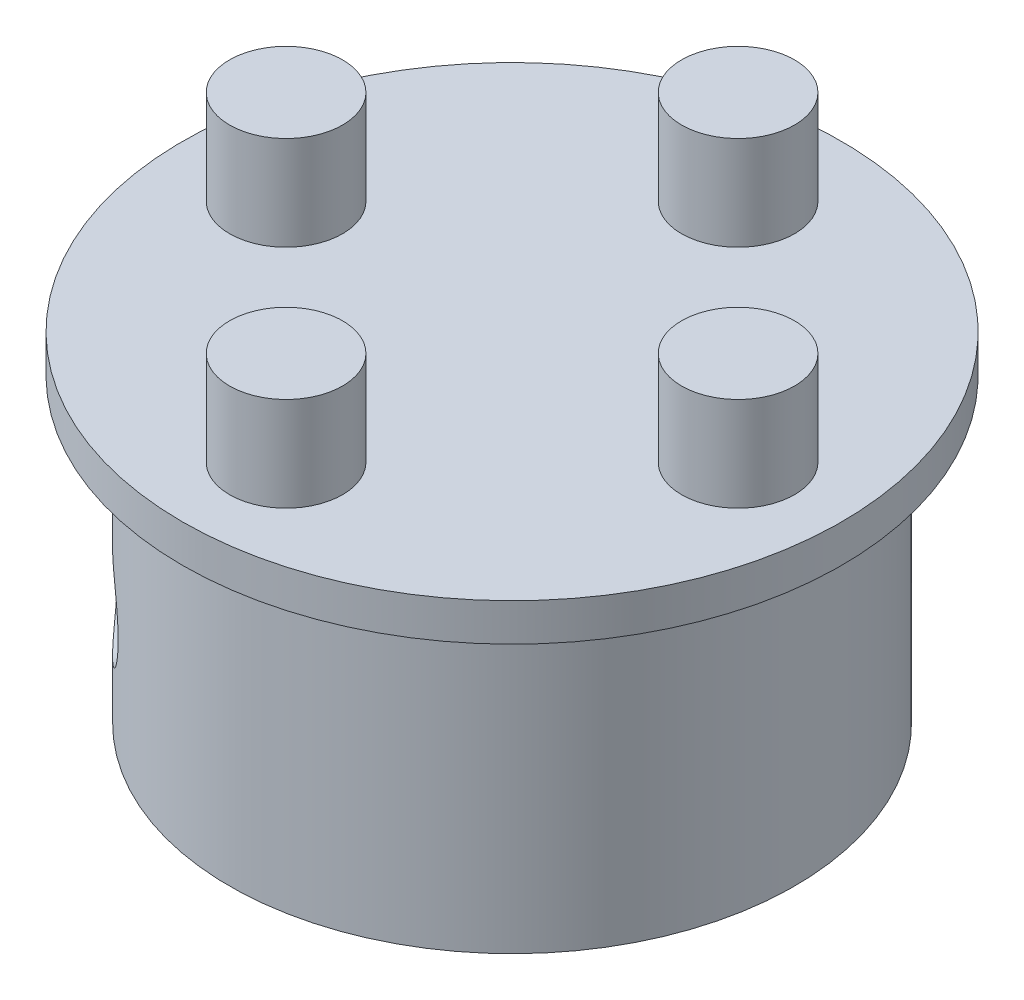
ISO-10303-21;
HEADER;
FILE_DESCRIPTION(('STEP AP214'),'2;1');
FILE_NAME('part.step','',(''),(''),'','','');
FILE_SCHEMA(('AUTOMOTIVE_DESIGN { 1 0 10303 214 1 1 1 1 }'));
ENDSEC;
DATA;
#1=APPLICATION_CONTEXT('core data for automotive mechanical design processes');
#2=APPLICATION_PROTOCOL_DEFINITION('international standard','automotive_design',2000,#1);
#3=PRODUCT_CONTEXT('',#1,'mechanical');
#4=PRODUCT('Part','Part','',(#3));
#5=PRODUCT_RELATED_PRODUCT_CATEGORY('part','',(#4));
#6=PRODUCT_DEFINITION_FORMATION('','',#4);
#7=PRODUCT_DEFINITION_CONTEXT('part definition',#1,'design');
#8=PRODUCT_DEFINITION('design','',#6,#7);
#9=PRODUCT_DEFINITION_SHAPE('','',#8);
#10=(LENGTH_UNIT() NAMED_UNIT(*) SI_UNIT(.MILLI.,.METRE.));
#11=(NAMED_UNIT(*) PLANE_ANGLE_UNIT() SI_UNIT($,.RADIAN.));
#12=(NAMED_UNIT(*) SI_UNIT($,.STERADIAN.) SOLID_ANGLE_UNIT());
#13=UNCERTAINTY_MEASURE_WITH_UNIT(LENGTH_MEASURE(1.E-05),#10,'distance_accuracy_value','');
#14=(GEOMETRIC_REPRESENTATION_CONTEXT(3) GLOBAL_UNCERTAINTY_ASSIGNED_CONTEXT((#13)) GLOBAL_UNIT_ASSIGNED_CONTEXT((#10,
#11,#12)) REPRESENTATION_CONTEXT('',''));
#15=CARTESIAN_POINT('',(0.,0.,0.));
#16=DIRECTION('',(0.,0.,1.));
#17=DIRECTION('',(1.,0.,0.));
#18=AXIS2_PLACEMENT_3D('',#15,#16,#17);
#19=CARTESIAN_POINT('',(0.,-16.,0.));
#20=DIRECTION('',(0.,1.,0.));
#21=DIRECTION('',(0.,0.,1.));
#22=AXIS2_PLACEMENT_3D('',#19,#20,#21);
#23=CYLINDRICAL_SURFACE('',#22,15.);
#24=CARTESIAN_POINT('',(0.,-16.,0.));
#25=DIRECTION('',(0.,-1.,0.));
#26=DIRECTION('',(0.,0.,-1.));
#27=AXIS2_PLACEMENT_3D('',#24,#25,#26);
#28=CIRCLE('',#27,15.);
#29=CARTESIAN_POINT('',(0.,-16.,-15.));
#30=VERTEX_POINT('',#29);
#31=EDGE_CURVE('E57',#30,#30,#28,.T.);
#32=ORIENTED_EDGE('',*,*,#31,.F.);
#33=EDGE_LOOP('',(#32));
#34=FACE_BOUND('',#33,.T.);
#35=CARTESIAN_POINT('',(0.,0.,0.));
#36=DIRECTION('',(0.,-1.,0.));
#37=DIRECTION('',(0.,0.,-1.));
#38=AXIS2_PLACEMENT_3D('',#35,#36,#37);
#39=CIRCLE('',#38,15.);
#40=CARTESIAN_POINT('',(0.,0.,-15.));
#41=VERTEX_POINT('',#40);
#42=EDGE_CURVE('E10',#41,#41,#39,.T.);
#43=ORIENTED_EDGE('',*,*,#42,.T.);
#44=EDGE_LOOP('',(#43));
#45=FACE_BOUND('',#44,.T.);
#46=CARTESIAN_POINT('',(-12.2260172846424,-10.4229808599025,8.69048337870951));
#47=CARTESIAN_POINT('',(-12.226015102749,-10.5623566080644,8.69048911864681));
#48=CARTESIAN_POINT('',(-12.2191559695436,-10.701808465974,8.7001610521806));
#49=CARTESIAN_POINT('',(-12.191795114123,-10.9767994031657,8.73845893769872));
#50=CARTESIAN_POINT('',(-12.1712808105791,-11.1123347536606,8.76710236914278));
#51=CARTESIAN_POINT('',(-12.1169009358028,-11.3754731432442,8.8421062297121));
#52=CARTESIAN_POINT('',(-12.0830465224063,-11.5030827085648,8.88845185151163));
#53=CARTESIAN_POINT('',(-12.0024511640444,-11.7469618146203,8.99698359757107));
#54=CARTESIAN_POINT('',(-11.9557116692274,-11.8632326294799,9.05916793920617));
#55=CARTESIAN_POINT('',(-11.849534387441,-12.0822937096471,9.19761875481193));
#56=CARTESIAN_POINT('',(-11.7899882067551,-12.1849559912888,9.27400462935664));
#57=CARTESIAN_POINT('',(-11.6593753942738,-12.3727741667644,9.43768547912518));
#58=CARTESIAN_POINT('',(-11.5883080801228,-12.457929023018,9.52498110042419));
#59=CARTESIAN_POINT('',(-11.4354583141163,-12.6087954271218,9.70796410468636));
#60=CARTESIAN_POINT('',(-11.3536144278216,-12.6743878676343,9.80369847366016));
#61=CARTESIAN_POINT('',(-11.1812553718978,-12.7835019304331,9.99982755370866));
#62=CARTESIAN_POINT('',(-11.0907407665399,-12.8270249877874,10.1002219612995));
#63=CARTESIAN_POINT('',(-10.9040893708528,-12.8903733948864,10.3014311335364));
#64=CARTESIAN_POINT('',(-10.8080121874521,-12.9104137759072,10.4022334644735));
#65=CARTESIAN_POINT('',(-10.6120648806183,-12.9268966140551,10.60205891587));
#66=CARTESIAN_POINT('',(-10.5121950154528,-12.9233406751498,10.7010821568047));
#67=CARTESIAN_POINT('',(-10.3125912431234,-12.8928995083743,10.8935532647143));
#68=CARTESIAN_POINT('',(-10.2128657866835,-12.8662456964934,10.9870466392295));
#69=CARTESIAN_POINT('',(-10.0156286044497,-12.7907297856561,11.1671406550701));
#70=CARTESIAN_POINT('',(-9.91811694617329,-12.741867010313,11.2537410863727));
#71=CARTESIAN_POINT('',(-9.72800092105717,-12.6230902195872,11.4184897971173));
#72=CARTESIAN_POINT('',(-9.63542106567276,-12.5530808478201,11.4965975640944));
#73=CARTESIAN_POINT('',(-9.45874951759188,-12.3940680372675,11.6423879310937));
#74=CARTESIAN_POINT('',(-9.37465851269917,-12.3050630611917,11.7100696865882));
#75=CARTESIAN_POINT('',(-9.21694697016389,-12.1093020532832,11.8346156486351));
#76=CARTESIAN_POINT('',(-9.14346583790286,-12.0023437650016,11.8913386542159));
#77=CARTESIAN_POINT('',(-9.01096223968904,-11.7743937696867,11.9920602075388));
#78=CARTESIAN_POINT('',(-8.95193990710789,-11.6534019332197,12.0360586379068));
#79=CARTESIAN_POINT('',(-8.85063857691095,-11.4005892180251,12.1107465207493));
#80=CARTESIAN_POINT('',(-8.80837840703758,-11.2687563618105,12.1414210110476));
#81=CARTESIAN_POINT('',(-8.7424787493457,-10.998131787595,12.1889594445614));
#82=CARTESIAN_POINT('',(-8.71883762196759,-10.8593406834701,12.205824603807));
#83=CARTESIAN_POINT('',(-8.69137309694338,-10.5805147037404,12.2253964599861));
#84=CARTESIAN_POINT('',(-8.68731638314832,-10.4405144802004,12.2282698494846));
#85=CARTESIAN_POINT('',(-8.69856432751127,-10.1616941882117,12.2202710469741));
#86=CARTESIAN_POINT('',(-8.713868237846,-10.0228740743886,12.2093993858813));
#87=CARTESIAN_POINT('',(-8.76301491468283,-9.75125310071168,12.1741720398917));
#88=CARTESIAN_POINT('',(-8.79673979908783,-9.61841972002453,12.1499020848004));
#89=CARTESIAN_POINT('',(-8.88125236105555,-9.36151069362306,12.0882618969943));
#90=CARTESIAN_POINT('',(-8.93204105934917,-9.23743557235164,12.0508908805886));
#91=CARTESIAN_POINT('',(-9.04922350572719,-9.00030626549644,11.96314927769));
#92=CARTESIAN_POINT('',(-9.11575686646056,-8.88736428714649,11.9126619687432));
#93=CARTESIAN_POINT('',(-9.26165435658245,-8.67686732720754,11.7995871178785));
#94=CARTESIAN_POINT('',(-9.34101938840285,-8.5793134287928,11.7369987248491));
#95=CARTESIAN_POINT('',(-9.51061176947301,-8.40132896717384,11.6000105839626));
#96=CARTESIAN_POINT('',(-9.60094350055352,-8.321087033618,11.5254947700273));
#97=CARTESIAN_POINT('',(-9.7886260213421,-8.18132553289766,11.3665255375608));
#98=CARTESIAN_POINT('',(-9.88597658388232,-8.12180529542869,11.2820724405986));
#99=CARTESIAN_POINT('',(-10.0839681570189,-8.02547027594768,11.1054532717412));
#100=CARTESIAN_POINT('',(-10.1845928127748,-7.98855678416762,11.0133227559656));
#101=CARTESIAN_POINT('',(-10.3862849909112,-7.93816526093871,10.8233204473603));
#102=CARTESIAN_POINT('',(-10.4873524761655,-7.92468530117019,10.7254491276204));
#103=CARTESIAN_POINT('',(-10.685636212747,-7.92159897759035,10.5278930277834));
#104=CARTESIAN_POINT('',(-10.7828842733313,-7.93170560596146,10.4282445395955));
#105=CARTESIAN_POINT('',(-10.9721290836373,-7.97488478217197,10.2289429223718));
#106=CARTESIAN_POINT('',(-11.0641258627609,-8.00795720141221,10.1292897933651));
#107=CARTESIAN_POINT('',(-11.2404991418113,-8.09601902544619,9.93320515098368));
#108=CARTESIAN_POINT('',(-11.3248839982044,-8.15098402811259,9.83677017982437));
#109=CARTESIAN_POINT('',(-11.4843390375278,-8.28123879613312,9.65013169078747));
#110=CARTESIAN_POINT('',(-11.5594087786578,-8.35652952496499,9.55992846856116));
#111=CARTESIAN_POINT('',(-11.6996397728828,-8.52631595236305,9.38780655473241));
#112=CARTESIAN_POINT('',(-11.7646776404091,-8.6210218146538,9.30599462836741));
#113=CARTESIAN_POINT('',(-11.8827363534089,-8.82650916780636,9.15476947871123));
#114=CARTESIAN_POINT('',(-11.935754380606,-8.93729441881508,9.0853591640167));
#115=CARTESIAN_POINT('',(-12.0292989396194,-9.17272618239216,8.96114243393515));
#116=CARTESIAN_POINT('',(-12.0697344599588,-9.29746519966803,8.9064427923207));
#117=CARTESIAN_POINT('',(-12.1369976176125,-9.55659009574069,8.81456513794917));
#118=CARTESIAN_POINT('',(-12.1638388501988,-9.69096618257991,8.77736962244662));
#119=CARTESIAN_POINT('',(-12.1977853703693,-9.92538462938993,8.73009687074421));
#120=CARTESIAN_POINT('',(-12.2083637940047,-10.0240076678652,8.71527408904282));
#121=CARTESIAN_POINT('',(-12.2224804710945,-10.2227343447395,8.69546537021194));
#122=CARTESIAN_POINT('',(-12.2260188523551,-10.3228379562267,8.69047925450573));
#123=CARTESIAN_POINT('',(-12.2260172846424,-10.4229808599025,8.69048337870951));
#124=B_SPLINE_CURVE_WITH_KNOTS('',3,(#46,#47,#48,#49,#50,#51,#52,#53,#54,#55,#56,#57,#58,#59,
#60,#61,#62,#63,#64,#65,#66,#67,#68,#69,#70,#71,#72,#73,#74,#75,#76,#77,#78,#79,#80,#81,#82,#83,
#84,#85,#86,#87,#88,#89,#90,#91,#92,#93,#94,#95,#96,#97,#98,#99,#100,#101,#102,#103,#104,#105,
#106,#107,#108,#109,#110,#111,#112,#113,#114,#115,#116,#117,#118,#119,#120,#121,#122,#123),
.UNSPECIFIED.,.T.,.F.,(4,2,2,2,2,2,2,2,2,2,2,2,2,2,2,2,2,2,2,2,2,2,2,2,2,2,2,2,2,2,2,2,2,2,2,2,
2,2,4),(0.,0.41776103892774,0.835907519962969,1.25370499787519,1.67145547405274,
2.09289159155714,2.51435267834447,2.93832980111435,3.36227935111113,3.78231567472565,
4.20232344652692,4.61817121164668,5.03403164249533,5.45179604139425,5.86959426226764,
6.29246123462124,6.71533210746019,7.13867662498604,7.56198385938077,7.98023542420411,
8.39847083413976,8.81406064635492,9.22967532293574,9.64912342762702,10.0686010443069,
10.4924411303538,10.916267504767,11.3382298441765,11.7601574591235,12.1769777626592,
12.5937957321882,13.0101503983246,13.4265248039234,13.8476699746325,14.2689137888181,
14.6931372761832,15.1169356674445,15.4171067054376,15.7172722940182),.UNSPECIFIED.);
#125=CARTESIAN_POINT('',(-12.2260172846424,-10.4229808599025,8.69048337870951));
#126=VERTEX_POINT('',#125);
#127=EDGE_CURVE('E39',#126,#126,#124,.T.);
#128=ORIENTED_EDGE('',*,*,#127,.F.);
#129=EDGE_LOOP('',(#128));
#130=FACE_BOUND('',#129,.T.);
#131=ADVANCED_FACE('F35',(#34,#45,#130),#23,.T.);
#132=CARTESIAN_POINT('',(0.,2.,0.));
#133=DIRECTION('',(0.,-1.,0.));
#134=DIRECTION('',(0.,0.,-1.));
#135=AXIS2_PLACEMENT_3D('',#132,#133,#134);
#136=CYLINDRICAL_SURFACE('',#135,17.5);
#137=CARTESIAN_POINT('',(0.,2.,0.));
#138=DIRECTION('',(0.,1.,0.));
#139=DIRECTION('',(0.,0.,1.));
#140=AXIS2_PLACEMENT_3D('',#137,#138,#139);
#141=CIRCLE('',#140,17.5);
#142=CARTESIAN_POINT('',(0.,2.,17.5));
#143=VERTEX_POINT('',#142);
#144=EDGE_CURVE('E48',#143,#143,#141,.T.);
#145=ORIENTED_EDGE('',*,*,#144,.F.);
#146=EDGE_LOOP('',(#145));
#147=FACE_BOUND('',#146,.T.);
#148=CARTESIAN_POINT('',(0.,0.,0.));
#149=DIRECTION('',(0.,1.,0.));
#150=DIRECTION('',(0.,0.,1.));
#151=AXIS2_PLACEMENT_3D('',#148,#149,#150);
#152=CIRCLE('',#151,17.5);
#153=CARTESIAN_POINT('',(0.,0.,17.5));
#154=VERTEX_POINT('',#153);
#155=EDGE_CURVE('E53',#154,#154,#152,.T.);
#156=ORIENTED_EDGE('',*,*,#155,.T.);
#157=EDGE_LOOP('',(#156));
#158=FACE_BOUND('',#157,.T.);
#159=ADVANCED_FACE('F37',(#147,#158),#136,.T.);
#160=CARTESIAN_POINT('',(0.,2.,0.));
#161=DIRECTION('',(0.,1.,0.));
#162=DIRECTION('',(0.,0.,1.));
#163=AXIS2_PLACEMENT_3D('',#160,#161,#162);
#164=PLANE('',#163);
#165=CARTESIAN_POINT('',(1.25693328198353E-13,2.,-12.));
#166=DIRECTION('',(0.,1.,0.));
#167=DIRECTION('',(0.,0.,1.));
#168=AXIS2_PLACEMENT_3D('',#165,#166,#167);
#169=CIRCLE('',#168,3.);
#170=CARTESIAN_POINT('',(1.25693328198353E-13,2.,-9.));
#171=VERTEX_POINT('',#170);
#172=EDGE_CURVE('E59',#171,#171,#169,.T.);
#173=ORIENTED_EDGE('',*,*,#172,.F.);
#174=EDGE_LOOP('',(#173));
#175=FACE_BOUND('',#174,.T.);
#176=CARTESIAN_POINT('',(-12.,2.,0.));
#177=DIRECTION('',(0.,1.,0.));
#178=DIRECTION('',(0.,0.,1.));
#179=AXIS2_PLACEMENT_3D('',#176,#177,#178);
#180=CIRCLE('',#179,3.);
#181=CARTESIAN_POINT('',(-12.,2.,2.99999999999992));
#182=VERTEX_POINT('',#181);
#183=EDGE_CURVE('E66',#182,#182,#180,.T.);
#184=ORIENTED_EDGE('',*,*,#183,.F.);
#185=EDGE_LOOP('',(#184));
#186=FACE_BOUND('',#185,.T.);
#187=CARTESIAN_POINT('',(0.,2.,12.));
#188=DIRECTION('',(0.,1.,0.));
#189=DIRECTION('',(0.,0.,1.));
#190=AXIS2_PLACEMENT_3D('',#187,#188,#189);
#191=CIRCLE('',#190,3.);
#192=CARTESIAN_POINT('',(0.,2.,15.));
#193=VERTEX_POINT('',#192);
#194=EDGE_CURVE('E72',#193,#193,#191,.T.);
#195=ORIENTED_EDGE('',*,*,#194,.F.);
#196=EDGE_LOOP('',(#195));
#197=FACE_BOUND('',#196,.T.);
#198=CARTESIAN_POINT('',(12.,2.,0.));
#199=DIRECTION('',(0.,1.,0.));
#200=DIRECTION('',(0.,0.,1.));
#201=AXIS2_PLACEMENT_3D('',#198,#199,#200);
#202=CIRCLE('',#201,3.);
#203=CARTESIAN_POINT('',(12.,2.,3.));
#204=VERTEX_POINT('',#203);
#205=EDGE_CURVE('E75',#204,#204,#202,.T.);
#206=ORIENTED_EDGE('',*,*,#205,.F.);
#207=EDGE_LOOP('',(#206));
#208=FACE_BOUND('',#207,.T.);
#209=ORIENTED_EDGE('',*,*,#144,.T.);
#210=EDGE_LOOP('',(#209));
#211=FACE_BOUND('',#210,.T.);
#212=ADVANCED_FACE('F89',(#175,#186,#197,#208,#211),#164,.T.);
#213=CARTESIAN_POINT('',(0.,0.,0.));
#214=DIRECTION('',(0.,1.,0.));
#215=DIRECTION('',(0.,0.,1.));
#216=AXIS2_PLACEMENT_3D('',#213,#214,#215);
#217=PLANE('',#216);
#218=ORIENTED_EDGE('',*,*,#42,.F.);
#219=EDGE_LOOP('',(#218));
#220=FACE_BOUND('',#219,.T.);
#221=ORIENTED_EDGE('',*,*,#155,.F.);
#222=EDGE_LOOP('',(#221));
#223=FACE_BOUND('',#222,.T.);
#224=ADVANCED_FACE('F86',(#220,#223),#217,.F.);
#225=CARTESIAN_POINT('',(12.,7.,0.));
#226=DIRECTION('',(0.,-1.,0.));
#227=DIRECTION('',(0.,0.,-1.));
#228=AXIS2_PLACEMENT_3D('',#225,#226,#227);
#229=CYLINDRICAL_SURFACE('',#228,3.);
#230=CARTESIAN_POINT('',(12.,7.,0.));
#231=DIRECTION('',(0.,1.,0.));
#232=DIRECTION('',(0.,0.,1.));
#233=AXIS2_PLACEMENT_3D('',#230,#231,#232);
#234=CIRCLE('',#233,3.);
#235=CARTESIAN_POINT('',(12.,7.,3.));
#236=VERTEX_POINT('',#235);
#237=EDGE_CURVE('E78',#236,#236,#234,.T.);
#238=ORIENTED_EDGE('',*,*,#237,.F.);
#239=EDGE_LOOP('',(#238));
#240=FACE_BOUND('',#239,.T.);
#241=ORIENTED_EDGE('',*,*,#205,.T.);
#242=EDGE_LOOP('',(#241));
#243=FACE_BOUND('',#242,.T.);
#244=ADVANCED_FACE('F88',(#240,#243),#229,.T.);
#245=CARTESIAN_POINT('',(12.,7.,0.));
#246=DIRECTION('',(0.,1.,0.));
#247=DIRECTION('',(0.,0.,1.));
#248=AXIS2_PLACEMENT_3D('',#245,#246,#247);
#249=PLANE('',#248);
#250=ORIENTED_EDGE('',*,*,#237,.T.);
#251=EDGE_LOOP('',(#250));
#252=FACE_BOUND('',#251,.T.);
#253=ADVANCED_FACE('F95',(#252),#249,.T.);
#254=CARTESIAN_POINT('',(0.,7.,12.));
#255=DIRECTION('',(0.,-1.,0.));
#256=DIRECTION('',(0.,0.,-1.));
#257=AXIS2_PLACEMENT_3D('',#254,#255,#256);
#258=CYLINDRICAL_SURFACE('',#257,3.);
#259=CARTESIAN_POINT('',(0.,7.,12.));
#260=DIRECTION('',(0.,1.,0.));
#261=DIRECTION('',(0.,0.,1.));
#262=AXIS2_PLACEMENT_3D('',#259,#260,#261);
#263=CIRCLE('',#262,3.);
#264=CARTESIAN_POINT('',(0.,7.,15.));
#265=VERTEX_POINT('',#264);
#266=EDGE_CURVE('E69',#265,#265,#263,.T.);
#267=ORIENTED_EDGE('',*,*,#266,.F.);
#268=EDGE_LOOP('',(#267));
#269=FACE_BOUND('',#268,.T.);
#270=ORIENTED_EDGE('',*,*,#194,.T.);
#271=EDGE_LOOP('',(#270));
#272=FACE_BOUND('',#271,.T.);
#273=ADVANCED_FACE('F129',(#269,#272),#258,.T.);
#274=CARTESIAN_POINT('',(0.,7.,12.));
#275=DIRECTION('',(0.,1.,0.));
#276=DIRECTION('',(0.,0.,1.));
#277=AXIS2_PLACEMENT_3D('',#274,#275,#276);
#278=PLANE('',#277);
#279=ORIENTED_EDGE('',*,*,#266,.T.);
#280=EDGE_LOOP('',(#279));
#281=FACE_BOUND('',#280,.T.);
#282=ADVANCED_FACE('F124',(#281),#278,.T.);
#283=CARTESIAN_POINT('',(-12.,7.,0.));
#284=DIRECTION('',(0.,-1.,0.));
#285=DIRECTION('',(0.,0.,-1.));
#286=AXIS2_PLACEMENT_3D('',#283,#284,#285);
#287=CYLINDRICAL_SURFACE('',#286,3.);
#288=CARTESIAN_POINT('',(-12.,7.,0.));
#289=DIRECTION('',(0.,1.,0.));
#290=DIRECTION('',(0.,0.,1.));
#291=AXIS2_PLACEMENT_3D('',#288,#289,#290);
#292=CIRCLE('',#291,3.);
#293=CARTESIAN_POINT('',(-12.,7.,2.99999999999992));
#294=VERTEX_POINT('',#293);
#295=EDGE_CURVE('E62',#294,#294,#292,.T.);
#296=ORIENTED_EDGE('',*,*,#295,.F.);
#297=EDGE_LOOP('',(#296));
#298=FACE_BOUND('',#297,.T.);
#299=ORIENTED_EDGE('',*,*,#183,.T.);
#300=EDGE_LOOP('',(#299));
#301=FACE_BOUND('',#300,.T.);
#302=ADVANCED_FACE('F121',(#298,#301),#287,.T.);
#303=CARTESIAN_POINT('',(-12.,7.,0.));
#304=DIRECTION('',(0.,1.,0.));
#305=DIRECTION('',(0.,0.,1.));
#306=AXIS2_PLACEMENT_3D('',#303,#304,#305);
#307=PLANE('',#306);
#308=ORIENTED_EDGE('',*,*,#295,.T.);
#309=EDGE_LOOP('',(#308));
#310=FACE_BOUND('',#309,.T.);
#311=ADVANCED_FACE('F116',(#310),#307,.T.);
#312=CARTESIAN_POINT('',(1.25693328198353E-13,7.,-12.));
#313=DIRECTION('',(0.,-1.,0.));
#314=DIRECTION('',(0.,0.,-1.));
#315=AXIS2_PLACEMENT_3D('',#312,#313,#314);
#316=CYLINDRICAL_SURFACE('',#315,3.);
#317=CARTESIAN_POINT('',(1.25693328198353E-13,7.,-12.));
#318=DIRECTION('',(0.,1.,0.));
#319=DIRECTION('',(0.,0.,1.));
#320=AXIS2_PLACEMENT_3D('',#317,#318,#319);
#321=CIRCLE('',#320,3.);
#322=CARTESIAN_POINT('',(1.25693328198353E-13,7.,-9.));
#323=VERTEX_POINT('',#322);
#324=EDGE_CURVE('E63',#323,#323,#321,.T.);
#325=ORIENTED_EDGE('',*,*,#324,.F.);
#326=EDGE_LOOP('',(#325));
#327=FACE_BOUND('',#326,.T.);
#328=ORIENTED_EDGE('',*,*,#172,.T.);
#329=EDGE_LOOP('',(#328));
#330=FACE_BOUND('',#329,.T.);
#331=ADVANCED_FACE('F112',(#327,#330),#316,.T.);
#332=CARTESIAN_POINT('',(1.25693328198353E-13,7.,-12.));
#333=DIRECTION('',(0.,1.,0.));
#334=DIRECTION('',(0.,0.,1.));
#335=AXIS2_PLACEMENT_3D('',#332,#333,#334);
#336=PLANE('',#335);
#337=ORIENTED_EDGE('',*,*,#324,.T.);
#338=EDGE_LOOP('',(#337));
#339=FACE_BOUND('',#338,.T.);
#340=ADVANCED_FACE('F115',(#339),#336,.T.);
#341=CARTESIAN_POINT('',(0.,-16.,0.));
#342=DIRECTION('',(0.,-1.,0.));
#343=DIRECTION('',(0.,0.,-1.));
#344=AXIS2_PLACEMENT_3D('',#341,#342,#343);
#345=PLANE('',#344);
#346=CARTESIAN_POINT('',(-10.,-16.,0.));
#347=DIRECTION('',(0.,-1.,0.));
#348=DIRECTION('',(0.,0.,-1.));
#349=AXIS2_PLACEMENT_3D('',#346,#347,#348);
#350=CIRCLE('',#349,2.);
#351=CARTESIAN_POINT('',(-10.,-16.,-2.));
#352=VERTEX_POINT('',#351);
#353=EDGE_CURVE('E375',#352,#352,#350,.T.);
#354=ORIENTED_EDGE('',*,*,#353,.F.);
#355=EDGE_LOOP('',(#354));
#356=FACE_BOUND('',#355,.T.);
#357=CARTESIAN_POINT('',(0.,-16.,10.));
#358=DIRECTION('',(0.,-1.,0.));
#359=DIRECTION('',(0.,0.,-1.));
#360=AXIS2_PLACEMENT_3D('',#357,#358,#359);
#361=CIRCLE('',#360,2.);
#362=CARTESIAN_POINT('',(0.,-16.,8.));
#363=VERTEX_POINT('',#362);
#364=EDGE_CURVE('E378',#363,#363,#361,.T.);
#365=ORIENTED_EDGE('',*,*,#364,.F.);
#366=EDGE_LOOP('',(#365));
#367=FACE_BOUND('',#366,.T.);
#368=CARTESIAN_POINT('',(10.,-16.,0.));
#369=DIRECTION('',(0.,-1.,0.));
#370=DIRECTION('',(0.,0.,-1.));
#371=AXIS2_PLACEMENT_3D('',#368,#369,#370);
#372=CIRCLE('',#371,2.);
#373=CARTESIAN_POINT('',(10.,-16.,-2.00000000000007));
#374=VERTEX_POINT('',#373);
#375=EDGE_CURVE('E384',#374,#374,#372,.T.);
#376=ORIENTED_EDGE('',*,*,#375,.F.);
#377=EDGE_LOOP('',(#376));
#378=FACE_BOUND('',#377,.T.);
#379=CARTESIAN_POINT('',(-1.04744440165294E-13,-16.,-10.));
#380=DIRECTION('',(0.,-1.,0.));
#381=DIRECTION('',(0.,0.,-1.));
#382=AXIS2_PLACEMENT_3D('',#379,#380,#381);
#383=CIRCLE('',#382,2.);
#384=CARTESIAN_POINT('',(-1.04744440165294E-13,-16.,-12.));
#385=VERTEX_POINT('',#384);
#386=EDGE_CURVE('E390',#385,#385,#383,.T.);
#387=ORIENTED_EDGE('',*,*,#386,.F.);
#388=EDGE_LOOP('',(#387));
#389=FACE_BOUND('',#388,.T.);
#390=ORIENTED_EDGE('',*,*,#31,.T.);
#391=EDGE_LOOP('',(#390));
#392=FACE_BOUND('',#391,.T.);
#393=ADVANCED_FACE('F110',(#356,#367,#378,#389,#392),#345,.T.);
#394=CARTESIAN_POINT('',(-1.04744440165294E-13,-11.,-10.));
#395=DIRECTION('',(0.,-1.,0.));
#396=DIRECTION('',(0.,0.,-1.));
#397=AXIS2_PLACEMENT_3D('',#394,#395,#396);
#398=CYLINDRICAL_SURFACE('',#397,2.);
#399=CARTESIAN_POINT('',(-1.04744440165294E-13,-11.,-10.));
#400=DIRECTION('',(0.,-1.,0.));
#401=DIRECTION('',(0.,0.,-1.));
#402=AXIS2_PLACEMENT_3D('',#399,#400,#401);
#403=CIRCLE('',#402,2.);
#404=CARTESIAN_POINT('',(-1.04744440165294E-13,-11.,-12.));
#405=VERTEX_POINT('',#404);
#406=EDGE_CURVE('E370',#405,#405,#403,.T.);
#407=ORIENTED_EDGE('',*,*,#406,.F.);
#408=EDGE_LOOP('',(#407));
#409=FACE_BOUND('',#408,.T.);
#410=ORIENTED_EDGE('',*,*,#386,.T.);
#411=EDGE_LOOP('',(#410));
#412=FACE_BOUND('',#411,.T.);
#413=ADVANCED_FACE('F178',(#409,#412),#398,.F.);
#414=CARTESIAN_POINT('',(-1.04744440165294E-13,-11.,-10.));
#415=DIRECTION('',(0.,-1.,0.));
#416=DIRECTION('',(0.,0.,-1.));
#417=AXIS2_PLACEMENT_3D('',#414,#415,#416);
#418=PLANE('',#417);
#419=ORIENTED_EDGE('',*,*,#406,.T.);
#420=EDGE_LOOP('',(#419));
#421=FACE_BOUND('',#420,.T.);
#422=ADVANCED_FACE('F185',(#421),#418,.T.);
#423=CARTESIAN_POINT('',(10.,-11.,0.));
#424=DIRECTION('',(0.,-1.,0.));
#425=DIRECTION('',(0.,0.,-1.));
#426=AXIS2_PLACEMENT_3D('',#423,#424,#425);
#427=CYLINDRICAL_SURFACE('',#426,2.);
#428=CARTESIAN_POINT('',(10.,-11.,0.));
#429=DIRECTION('',(0.,-1.,0.));
#430=DIRECTION('',(0.,0.,-1.));
#431=AXIS2_PLACEMENT_3D('',#428,#429,#430);
#432=CIRCLE('',#431,2.);
#433=CARTESIAN_POINT('',(10.,-11.,-2.00000000000007));
#434=VERTEX_POINT('',#433);
#435=EDGE_CURVE('E387',#434,#434,#432,.T.);
#436=ORIENTED_EDGE('',*,*,#435,.F.);
#437=EDGE_LOOP('',(#436));
#438=FACE_BOUND('',#437,.T.);
#439=ORIENTED_EDGE('',*,*,#375,.T.);
#440=EDGE_LOOP('',(#439));
#441=FACE_BOUND('',#440,.T.);
#442=ADVANCED_FACE('F193',(#438,#441),#427,.F.);
#443=CARTESIAN_POINT('',(10.,-11.,0.));
#444=DIRECTION('',(0.,-1.,0.));
#445=DIRECTION('',(0.,0.,-1.));
#446=AXIS2_PLACEMENT_3D('',#443,#444,#445);
#447=PLANE('',#446);
#448=ORIENTED_EDGE('',*,*,#435,.T.);
#449=EDGE_LOOP('',(#448));
#450=FACE_BOUND('',#449,.T.);
#451=ADVANCED_FACE('F200',(#450),#447,.T.);
#452=CARTESIAN_POINT('',(0.,-11.,10.));
#453=DIRECTION('',(0.,-1.,0.));
#454=DIRECTION('',(0.,0.,-1.));
#455=AXIS2_PLACEMENT_3D('',#452,#453,#454);
#456=CYLINDRICAL_SURFACE('',#455,2.);
#457=CARTESIAN_POINT('',(0.,-11.,10.));
#458=DIRECTION('',(0.,-1.,0.));
#459=DIRECTION('',(0.,0.,-1.));
#460=AXIS2_PLACEMENT_3D('',#457,#458,#459);
#461=CIRCLE('',#460,2.);
#462=CARTESIAN_POINT('',(0.,-11.,8.));
#463=VERTEX_POINT('',#462);
#464=EDGE_CURVE('E381',#463,#463,#461,.T.);
#465=ORIENTED_EDGE('',*,*,#464,.F.);
#466=EDGE_LOOP('',(#465));
#467=FACE_BOUND('',#466,.T.);
#468=ORIENTED_EDGE('',*,*,#364,.T.);
#469=EDGE_LOOP('',(#468));
#470=FACE_BOUND('',#469,.T.);
#471=ADVANCED_FACE('F208',(#467,#470),#456,.F.);
#472=CARTESIAN_POINT('',(0.,-11.,10.));
#473=DIRECTION('',(0.,-1.,0.));
#474=DIRECTION('',(0.,0.,-1.));
#475=AXIS2_PLACEMENT_3D('',#472,#473,#474);
#476=PLANE('',#475);
#477=ORIENTED_EDGE('',*,*,#464,.T.);
#478=EDGE_LOOP('',(#477));
#479=FACE_BOUND('',#478,.T.);
#480=ADVANCED_FACE('F216',(#479),#476,.T.);
#481=CARTESIAN_POINT('',(-10.,-11.,0.));
#482=DIRECTION('',(0.,-1.,0.));
#483=DIRECTION('',(0.,0.,-1.));
#484=AXIS2_PLACEMENT_3D('',#481,#482,#483);
#485=CYLINDRICAL_SURFACE('',#484,2.);
#486=CARTESIAN_POINT('',(-10.,-11.,0.));
#487=DIRECTION('',(0.,-1.,0.));
#488=DIRECTION('',(0.,0.,-1.));
#489=AXIS2_PLACEMENT_3D('',#486,#487,#488);
#490=CIRCLE('',#489,2.);
#491=CARTESIAN_POINT('',(-10.,-11.,-2.));
#492=VERTEX_POINT('',#491);
#493=EDGE_CURVE('E372',#492,#492,#490,.T.);
#494=ORIENTED_EDGE('',*,*,#493,.F.);
#495=EDGE_LOOP('',(#494));
#496=FACE_BOUND('',#495,.T.);
#497=ORIENTED_EDGE('',*,*,#353,.T.);
#498=EDGE_LOOP('',(#497));
#499=FACE_BOUND('',#498,.T.);
#500=ADVANCED_FACE('F224',(#496,#499),#485,.F.);
#501=CARTESIAN_POINT('',(-10.,-11.,0.));
#502=DIRECTION('',(0.,-1.,0.));
#503=DIRECTION('',(0.,0.,-1.));
#504=AXIS2_PLACEMENT_3D('',#501,#502,#503);
#505=PLANE('',#504);
#506=ORIENTED_EDGE('',*,*,#493,.T.);
#507=EDGE_LOOP('',(#506));
#508=FACE_BOUND('',#507,.T.);
#509=ADVANCED_FACE('F232',(#508),#505,.T.);
#510=CARTESIAN_POINT('',(-15.1923881554252,-10.4229808599025,15.192388155425));
#511=DIRECTION('',(0.707106781186551,0.,-0.707106781186544));
#512=DIRECTION('',(-0.707106781186544,0.,-0.707106781186551));
#513=AXIS2_PLACEMENT_3D('',#510,#511,#512);
#514=CYLINDRICAL_SURFACE('',#513,2.5);
#515=CARTESIAN_POINT('',(-8.12132034355968,-10.4229808599025,8.12132034355959));
#516=DIRECTION('',(-0.707106781186551,0.,0.707106781186544));
#517=DIRECTION('',(0.707106781186544,0.,0.707106781186551));
#518=AXIS2_PLACEMENT_3D('',#515,#516,#517);
#519=CIRCLE('',#518,2.5);
#520=CARTESIAN_POINT('',(-6.35355339059331,-10.4229808599025,9.88908729652597));
#521=VERTEX_POINT('',#520);
#522=EDGE_CURVE('E367',#521,#521,#519,.T.);
#523=ORIENTED_EDGE('',*,*,#522,.F.);
#524=EDGE_LOOP('',(#523));
#525=FACE_BOUND('',#524,.T.);
#526=ORIENTED_EDGE('',*,*,#127,.T.);
#527=EDGE_LOOP('',(#526));
#528=FACE_BOUND('',#527,.T.);
#529=ADVANCED_FACE('F240',(#525,#528),#514,.F.);
#530=CARTESIAN_POINT('',(-8.12132034355968,-10.4229808599025,8.12132034355959));
#531=DIRECTION('',(-0.707106781186551,0.,0.707106781186544));
#532=DIRECTION('',(0.707106781186544,0.,0.707106781186551));
#533=AXIS2_PLACEMENT_3D('',#530,#531,#532);
#534=PLANE('',#533);
#535=ORIENTED_EDGE('',*,*,#522,.T.);
#536=EDGE_LOOP('',(#535));
#537=FACE_BOUND('',#536,.T.);
#538=ADVANCED_FACE('F248',(#537),#534,.T.);
#539=CLOSED_SHELL('',(#131,#159,#212,#224,#244,#253,#273,#282,#302,#311,#331,#340,#393,#413,
#422,#442,#451,#471,#480,#500,#509,#529,#538));
#540=MANIFOLD_SOLID_BREP('B2',#539);
#541=ADVANCED_BREP_SHAPE_REPRESENTATION('',(#18,#540),#14);
#542=SHAPE_DEFINITION_REPRESENTATION(#9,#541);
ENDSEC;
END-ISO-10303-21;
